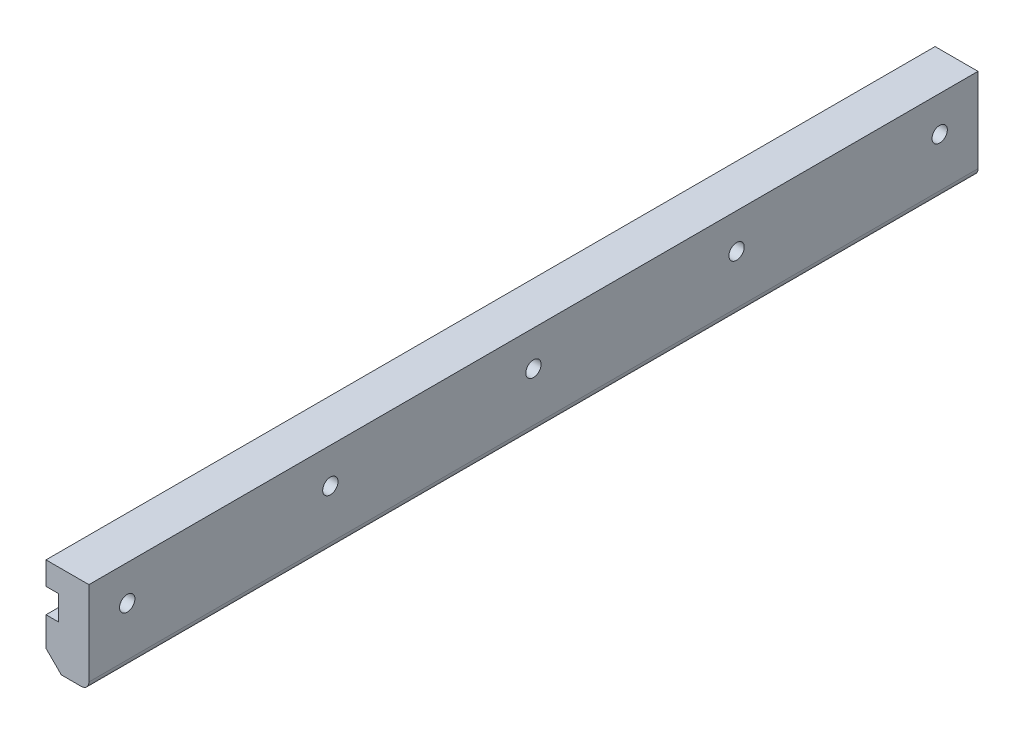
ISO-10303-21;
HEADER;
FILE_DESCRIPTION(('STEP AP214'),'2;1');
FILE_NAME('part.step','',(''),(''),'','','');
FILE_SCHEMA(('AUTOMOTIVE_DESIGN { 1 0 10303 214 1 1 1 1 }'));
ENDSEC;
DATA;
#1=APPLICATION_CONTEXT('core data for automotive mechanical design processes');
#2=APPLICATION_PROTOCOL_DEFINITION('international standard','automotive_design',2000,#1);
#3=PRODUCT_CONTEXT('',#1,'mechanical');
#4=PRODUCT('Part','Part','',(#3));
#5=PRODUCT_RELATED_PRODUCT_CATEGORY('part','',(#4));
#6=PRODUCT_DEFINITION_FORMATION('','',#4);
#7=PRODUCT_DEFINITION_CONTEXT('part definition',#1,'design');
#8=PRODUCT_DEFINITION('design','',#6,#7);
#9=PRODUCT_DEFINITION_SHAPE('','',#8);
#10=(LENGTH_UNIT() NAMED_UNIT(*) SI_UNIT(.MILLI.,.METRE.));
#11=(NAMED_UNIT(*) PLANE_ANGLE_UNIT() SI_UNIT($,.RADIAN.));
#12=(NAMED_UNIT(*) SI_UNIT($,.STERADIAN.) SOLID_ANGLE_UNIT());
#13=UNCERTAINTY_MEASURE_WITH_UNIT(LENGTH_MEASURE(1.E-05),#10,'distance_accuracy_value','');
#14=(GEOMETRIC_REPRESENTATION_CONTEXT(3) GLOBAL_UNCERTAINTY_ASSIGNED_CONTEXT((#13)) GLOBAL_UNIT_ASSIGNED_CONTEXT((#10,
#11,#12)) REPRESENTATION_CONTEXT('',''));
#15=CARTESIAN_POINT('',(0.,0.,0.));
#16=DIRECTION('',(0.,0.,1.));
#17=DIRECTION('',(1.,0.,0.));
#18=AXIS2_PLACEMENT_3D('',#15,#16,#17);
#19=CARTESIAN_POINT('',(-28.,60.,290.));
#20=DIRECTION('',(0.,-1.,0.));
#21=DIRECTION('',(0.,0.,-1.));
#22=AXIS2_PLACEMENT_3D('',#19,#20,#21);
#23=PLANE('',#22);
#24=DIRECTION('',(-1.,0.,0.));
#25=VECTOR('',#24,1.);
#26=CARTESIAN_POINT('',(-28.,60.,-290.));
#27=LINE('',#26,#25);
#28=CARTESIAN_POINT('',(0.,60.,-290.));
#29=VERTEX_POINT('',#28);
#30=CARTESIAN_POINT('',(-28.,60.,-290.));
#31=VERTEX_POINT('',#30);
#32=EDGE_CURVE('E158',#29,#31,#27,.T.);
#33=ORIENTED_EDGE('',*,*,#32,.T.);
#34=DIRECTION('',(0.,0.,-1.));
#35=VECTOR('',#34,1.);
#36=CARTESIAN_POINT('',(-28.,60.,290.));
#37=LINE('',#36,#35);
#38=CARTESIAN_POINT('',(-28.,60.,290.));
#39=VERTEX_POINT('',#38);
#40=EDGE_CURVE('E11',#39,#31,#37,.T.);
#41=ORIENTED_EDGE('',*,*,#40,.F.);
#42=DIRECTION('',(-1.,0.,0.));
#43=VECTOR('',#42,1.);
#44=CARTESIAN_POINT('',(-28.,60.,290.));
#45=LINE('',#44,#43);
#46=CARTESIAN_POINT('',(0.,60.,290.));
#47=VERTEX_POINT('',#46);
#48=EDGE_CURVE('E187',#47,#39,#45,.T.);
#49=ORIENTED_EDGE('',*,*,#48,.F.);
#50=DIRECTION('',(0.,0.,-1.));
#51=VECTOR('',#50,1.);
#52=CARTESIAN_POINT('',(0.,60.,290.));
#53=LINE('',#52,#51);
#54=EDGE_CURVE('E154',#47,#29,#53,.T.);
#55=ORIENTED_EDGE('',*,*,#54,.T.);
#56=EDGE_LOOP('',(#33,#41,#49,#55));
#57=FACE_BOUND('',#56,.T.);
#58=ADVANCED_FACE('F45',(#57),#23,.F.);
#59=CARTESIAN_POINT('',(-28.,45.,290.));
#60=DIRECTION('',(1.,0.,0.));
#61=DIRECTION('',(0.,0.,-1.));
#62=AXIS2_PLACEMENT_3D('',#59,#60,#61);
#63=PLANE('',#62);
#64=DIRECTION('',(0.,-1.,0.));
#65=VECTOR('',#64,1.);
#66=CARTESIAN_POINT('',(-28.,45.,-290.));
#67=LINE('',#66,#65);
#68=CARTESIAN_POINT('',(-28.,45.,-290.));
#69=VERTEX_POINT('',#68);
#70=EDGE_CURVE('E162',#31,#69,#67,.T.);
#71=ORIENTED_EDGE('',*,*,#70,.T.);
#72=DIRECTION('',(0.,0.,-1.));
#73=VECTOR('',#72,1.);
#74=CARTESIAN_POINT('',(-28.,45.,290.));
#75=LINE('',#74,#73);
#76=CARTESIAN_POINT('',(-28.,45.,290.));
#77=VERTEX_POINT('',#76);
#78=EDGE_CURVE('E54',#77,#69,#75,.T.);
#79=ORIENTED_EDGE('',*,*,#78,.F.);
#80=DIRECTION('',(0.,-1.,0.));
#81=VECTOR('',#80,1.);
#82=CARTESIAN_POINT('',(-28.,45.,290.));
#83=LINE('',#82,#81);
#84=EDGE_CURVE('E111',#39,#77,#83,.T.);
#85=ORIENTED_EDGE('',*,*,#84,.F.);
#86=ORIENTED_EDGE('',*,*,#40,.T.);
#87=EDGE_LOOP('',(#71,#79,#85,#86));
#88=FACE_BOUND('',#87,.T.);
#89=ADVANCED_FACE('F321',(#88),#63,.F.);
#90=CARTESIAN_POINT('',(-20.,45.,290.));
#91=DIRECTION('',(0.,1.,0.));
#92=DIRECTION('',(-1.,0.,0.));
#93=AXIS2_PLACEMENT_3D('',#90,#91,#92);
#94=PLANE('',#93);
#95=DIRECTION('',(1.,0.,0.));
#96=VECTOR('',#95,1.);
#97=CARTESIAN_POINT('',(-20.,45.,-290.));
#98=LINE('',#97,#96);
#99=CARTESIAN_POINT('',(-20.,45.,-290.));
#100=VERTEX_POINT('',#99);
#101=EDGE_CURVE('E166',#69,#100,#98,.T.);
#102=ORIENTED_EDGE('',*,*,#101,.T.);
#103=DIRECTION('',(0.,0.,-1.));
#104=VECTOR('',#103,1.);
#105=CARTESIAN_POINT('',(-20.,45.,290.));
#106=LINE('',#105,#104);
#107=CARTESIAN_POINT('',(-20.,45.,290.));
#108=VERTEX_POINT('',#107);
#109=EDGE_CURVE('E206',#108,#100,#106,.T.);
#110=ORIENTED_EDGE('',*,*,#109,.F.);
#111=DIRECTION('',(1.,0.,0.));
#112=VECTOR('',#111,1.);
#113=CARTESIAN_POINT('',(-20.,45.,290.));
#114=LINE('',#113,#112);
#115=EDGE_CURVE('E216',#77,#108,#114,.T.);
#116=ORIENTED_EDGE('',*,*,#115,.F.);
#117=ORIENTED_EDGE('',*,*,#78,.T.);
#118=EDGE_LOOP('',(#102,#110,#116,#117));
#119=FACE_BOUND('',#118,.T.);
#120=ADVANCED_FACE('F214',(#119),#94,.F.);
#121=CARTESIAN_POINT('',(-20.,29.,290.));
#122=DIRECTION('',(1.,0.,0.));
#123=DIRECTION('',(0.,0.,-1.));
#124=AXIS2_PLACEMENT_3D('',#121,#122,#123);
#125=PLANE('',#124);
#126=CARTESIAN_POINT('',(-20.,37.,265.));
#127=DIRECTION('',(1.,0.,0.));
#128=DIRECTION('',(0.,0.,-1.));
#129=AXIS2_PLACEMENT_3D('',#126,#127,#128);
#130=CIRCLE('',#129,4.99999999999999);
#131=CARTESIAN_POINT('',(-20.,37.,260.));
#132=VERTEX_POINT('',#131);
#133=EDGE_CURVE('E163',#132,#132,#130,.T.);
#134=ORIENTED_EDGE('',*,*,#133,.T.);
#135=EDGE_LOOP('',(#134));
#136=FACE_BOUND('',#135,.T.);
#137=CARTESIAN_POINT('',(-20.,37.,132.5));
#138=DIRECTION('',(1.,0.,0.));
#139=DIRECTION('',(0.,0.,-1.));
#140=AXIS2_PLACEMENT_3D('',#137,#138,#139);
#141=CIRCLE('',#140,4.99999999999999);
#142=CARTESIAN_POINT('',(-20.,37.,127.5));
#143=VERTEX_POINT('',#142);
#144=EDGE_CURVE('E252',#143,#143,#141,.T.);
#145=ORIENTED_EDGE('',*,*,#144,.T.);
#146=EDGE_LOOP('',(#145));
#147=FACE_BOUND('',#146,.T.);
#148=CARTESIAN_POINT('',(-20.,37.,0.));
#149=DIRECTION('',(1.,0.,0.));
#150=DIRECTION('',(0.,0.,-1.));
#151=AXIS2_PLACEMENT_3D('',#148,#149,#150);
#152=CIRCLE('',#151,4.99999999999999);
#153=CARTESIAN_POINT('',(-20.,37.,-5.00000000000005));
#154=VERTEX_POINT('',#153);
#155=EDGE_CURVE('E256',#154,#154,#152,.T.);
#156=ORIENTED_EDGE('',*,*,#155,.T.);
#157=EDGE_LOOP('',(#156));
#158=FACE_BOUND('',#157,.T.);
#159=CARTESIAN_POINT('',(-20.,37.,-132.5));
#160=DIRECTION('',(1.,0.,0.));
#161=DIRECTION('',(0.,0.,-1.));
#162=AXIS2_PLACEMENT_3D('',#159,#160,#161);
#163=CIRCLE('',#162,4.99999999999999);
#164=CARTESIAN_POINT('',(-20.,37.,-137.5));
#165=VERTEX_POINT('',#164);
#166=EDGE_CURVE('E260',#165,#165,#163,.T.);
#167=ORIENTED_EDGE('',*,*,#166,.T.);
#168=EDGE_LOOP('',(#167));
#169=FACE_BOUND('',#168,.T.);
#170=CARTESIAN_POINT('',(-20.,37.,-265.));
#171=DIRECTION('',(1.,0.,0.));
#172=DIRECTION('',(0.,0.,-1.));
#173=AXIS2_PLACEMENT_3D('',#170,#171,#172);
#174=CIRCLE('',#173,4.99999999999999);
#175=CARTESIAN_POINT('',(-20.,37.,-270.));
#176=VERTEX_POINT('',#175);
#177=EDGE_CURVE('E264',#176,#176,#174,.T.);
#178=ORIENTED_EDGE('',*,*,#177,.T.);
#179=EDGE_LOOP('',(#178));
#180=FACE_BOUND('',#179,.T.);
#181=DIRECTION('',(0.,-1.,0.));
#182=VECTOR('',#181,1.);
#183=CARTESIAN_POINT('',(-20.,29.,-290.));
#184=LINE('',#183,#182);
#185=CARTESIAN_POINT('',(-20.,29.,-290.));
#186=VERTEX_POINT('',#185);
#187=EDGE_CURVE('E169',#100,#186,#184,.T.);
#188=ORIENTED_EDGE('',*,*,#187,.T.);
#189=DIRECTION('',(0.,0.,-1.));
#190=VECTOR('',#189,1.);
#191=CARTESIAN_POINT('',(-20.,29.,290.));
#192=LINE('',#191,#190);
#193=CARTESIAN_POINT('',(-20.,29.,290.));
#194=VERTEX_POINT('',#193);
#195=EDGE_CURVE('E202',#194,#186,#192,.T.);
#196=ORIENTED_EDGE('',*,*,#195,.F.);
#197=DIRECTION('',(0.,-1.,0.));
#198=VECTOR('',#197,1.);
#199=CARTESIAN_POINT('',(-20.,29.,290.));
#200=LINE('',#199,#198);
#201=EDGE_CURVE('E235',#108,#194,#200,.T.);
#202=ORIENTED_EDGE('',*,*,#201,.F.);
#203=ORIENTED_EDGE('',*,*,#109,.T.);
#204=EDGE_LOOP('',(#188,#196,#202,#203));
#205=FACE_BOUND('',#204,.T.);
#206=ADVANCED_FACE('F225',(#136,#147,#158,#169,#180,#205),#125,.F.);
#207=CARTESIAN_POINT('',(-28.,29.,290.));
#208=DIRECTION('',(0.,-1.,0.));
#209=DIRECTION('',(0.,0.,-1.));
#210=AXIS2_PLACEMENT_3D('',#207,#208,#209);
#211=PLANE('',#210);
#212=DIRECTION('',(-1.,0.,0.));
#213=VECTOR('',#212,1.);
#214=CARTESIAN_POINT('',(-28.,29.,-290.));
#215=LINE('',#214,#213);
#216=CARTESIAN_POINT('',(-28.,29.,-290.));
#217=VERTEX_POINT('',#216);
#218=EDGE_CURVE('E172',#186,#217,#215,.T.);
#219=ORIENTED_EDGE('',*,*,#218,.T.);
#220=DIRECTION('',(0.,0.,-1.));
#221=VECTOR('',#220,1.);
#222=CARTESIAN_POINT('',(-28.,29.,290.));
#223=LINE('',#222,#221);
#224=CARTESIAN_POINT('',(-28.,29.,290.));
#225=VERTEX_POINT('',#224);
#226=EDGE_CURVE('E198',#225,#217,#223,.T.);
#227=ORIENTED_EDGE('',*,*,#226,.F.);
#228=DIRECTION('',(-1.,0.,0.));
#229=VECTOR('',#228,1.);
#230=CARTESIAN_POINT('',(-28.,29.,290.));
#231=LINE('',#230,#229);
#232=EDGE_CURVE('E231',#194,#225,#231,.T.);
#233=ORIENTED_EDGE('',*,*,#232,.F.);
#234=ORIENTED_EDGE('',*,*,#195,.T.);
#235=EDGE_LOOP('',(#219,#227,#233,#234));
#236=FACE_BOUND('',#235,.T.);
#237=ADVANCED_FACE('F229',(#236),#211,.F.);
#238=CARTESIAN_POINT('',(-28.,10.,290.));
#239=DIRECTION('',(1.,0.,0.));
#240=DIRECTION('',(0.,0.,-1.));
#241=AXIS2_PLACEMENT_3D('',#238,#239,#240);
#242=PLANE('',#241);
#243=DIRECTION('',(0.,-1.,0.));
#244=VECTOR('',#243,1.);
#245=CARTESIAN_POINT('',(-28.,10.,-290.));
#246=LINE('',#245,#244);
#247=CARTESIAN_POINT('',(-28.,10.,-290.));
#248=VERTEX_POINT('',#247);
#249=EDGE_CURVE('E175',#217,#248,#246,.T.);
#250=ORIENTED_EDGE('',*,*,#249,.T.);
#251=DIRECTION('',(0.,0.,-1.));
#252=VECTOR('',#251,1.);
#253=CARTESIAN_POINT('',(-28.,10.,290.));
#254=LINE('',#253,#252);
#255=CARTESIAN_POINT('',(-28.,10.,290.));
#256=VERTEX_POINT('',#255);
#257=EDGE_CURVE('E194',#256,#248,#254,.T.);
#258=ORIENTED_EDGE('',*,*,#257,.F.);
#259=DIRECTION('',(0.,-1.,0.));
#260=VECTOR('',#259,1.);
#261=CARTESIAN_POINT('',(-28.,10.,290.));
#262=LINE('',#261,#260);
#263=EDGE_CURVE('E234',#225,#256,#262,.T.);
#264=ORIENTED_EDGE('',*,*,#263,.F.);
#265=ORIENTED_EDGE('',*,*,#226,.T.);
#266=EDGE_LOOP('',(#250,#258,#264,#265));
#267=FACE_BOUND('',#266,.T.);
#268=ADVANCED_FACE('F318',(#267),#242,.F.);
#269=CARTESIAN_POINT('',(-18.,0.,290.));
#270=DIRECTION('',(0.707106781186546,0.707106781186549,0.));
#271=DIRECTION('',(-0.707106781186549,0.707106781186546,0.));
#272=AXIS2_PLACEMENT_3D('',#269,#270,#271);
#273=PLANE('',#272);
#274=DIRECTION('',(0.707106781186549,-0.707106781186546,0.));
#275=VECTOR('',#274,1.);
#276=CARTESIAN_POINT('',(-18.,0.,-290.));
#277=LINE('',#276,#275);
#278=CARTESIAN_POINT('',(-18.,0.,-290.));
#279=VERTEX_POINT('',#278);
#280=EDGE_CURVE('E178',#248,#279,#277,.T.);
#281=ORIENTED_EDGE('',*,*,#280,.T.);
#282=DIRECTION('',(0.,0.,-1.));
#283=VECTOR('',#282,1.);
#284=CARTESIAN_POINT('',(-18.,0.,290.));
#285=LINE('',#284,#283);
#286=CARTESIAN_POINT('',(-18.,0.,290.));
#287=VERTEX_POINT('',#286);
#288=EDGE_CURVE('E147',#287,#279,#285,.T.);
#289=ORIENTED_EDGE('',*,*,#288,.F.);
#290=DIRECTION('',(0.707106781186549,-0.707106781186546,0.));
#291=VECTOR('',#290,1.);
#292=CARTESIAN_POINT('',(-18.,0.,290.));
#293=LINE('',#292,#291);
#294=EDGE_CURVE('E136',#256,#287,#293,.T.);
#295=ORIENTED_EDGE('',*,*,#294,.F.);
#296=ORIENTED_EDGE('',*,*,#257,.T.);
#297=EDGE_LOOP('',(#281,#289,#295,#296));
#298=FACE_BOUND('',#297,.T.);
#299=ADVANCED_FACE('F333',(#298),#273,.F.);
#300=CARTESIAN_POINT('',(-5.00000000000003,0.,290.));
#301=DIRECTION('',(0.,1.,0.));
#302=DIRECTION('',(-1.,0.,0.));
#303=AXIS2_PLACEMENT_3D('',#300,#301,#302);
#304=PLANE('',#303);
#305=DIRECTION('',(1.,0.,0.));
#306=VECTOR('',#305,1.);
#307=CARTESIAN_POINT('',(-5.00000000000003,0.,-290.));
#308=LINE('',#307,#306);
#309=CARTESIAN_POINT('',(-5.00000000000003,0.,-290.));
#310=VERTEX_POINT('',#309);
#311=EDGE_CURVE('E145',#279,#310,#308,.T.);
#312=ORIENTED_EDGE('',*,*,#311,.T.);
#313=DIRECTION('',(0.,0.,-1.));
#314=VECTOR('',#313,1.);
#315=CARTESIAN_POINT('',(-5.00000000000003,0.,290.));
#316=LINE('',#315,#314);
#317=CARTESIAN_POINT('',(-5.00000000000003,0.,290.));
#318=VERTEX_POINT('',#317);
#319=EDGE_CURVE('E142',#318,#310,#316,.T.);
#320=ORIENTED_EDGE('',*,*,#319,.F.);
#321=DIRECTION('',(1.,0.,0.));
#322=VECTOR('',#321,1.);
#323=CARTESIAN_POINT('',(-5.00000000000003,0.,290.));
#324=LINE('',#323,#322);
#325=EDGE_CURVE('E130',#287,#318,#324,.T.);
#326=ORIENTED_EDGE('',*,*,#325,.F.);
#327=ORIENTED_EDGE('',*,*,#288,.T.);
#328=EDGE_LOOP('',(#312,#320,#326,#327));
#329=FACE_BOUND('',#328,.T.);
#330=ADVANCED_FACE('F143',(#329),#304,.F.);
#331=CARTESIAN_POINT('',(-5.,5.,290.));
#332=DIRECTION('',(0.,0.,-1.));
#333=DIRECTION('',(-1.,0.,0.));
#334=AXIS2_PLACEMENT_3D('',#331,#332,#333);
#335=CYLINDRICAL_SURFACE('',#334,5.);
#336=CARTESIAN_POINT('',(-5.,5.,-290.));
#337=DIRECTION('',(0.,0.,1.));
#338=DIRECTION('',(-1.,0.,0.));
#339=AXIS2_PLACEMENT_3D('',#336,#337,#338);
#340=CIRCLE('',#339,5.);
#341=CARTESIAN_POINT('',(0.,5.00000000000003,-290.));
#342=VERTEX_POINT('',#341);
#343=EDGE_CURVE('E97',#310,#342,#340,.T.);
#344=ORIENTED_EDGE('',*,*,#343,.T.);
#345=DIRECTION('',(0.,0.,-1.));
#346=VECTOR('',#345,1.);
#347=CARTESIAN_POINT('',(0.,5.00000000000003,290.));
#348=LINE('',#347,#346);
#349=CARTESIAN_POINT('',(0.,5.00000000000003,290.));
#350=VERTEX_POINT('',#349);
#351=EDGE_CURVE('E148',#350,#342,#348,.T.);
#352=ORIENTED_EDGE('',*,*,#351,.F.);
#353=CARTESIAN_POINT('',(-5.,5.,290.));
#354=DIRECTION('',(0.,0.,1.));
#355=DIRECTION('',(-1.,0.,0.));
#356=AXIS2_PLACEMENT_3D('',#353,#354,#355);
#357=CIRCLE('',#356,5.);
#358=EDGE_CURVE('E134',#318,#350,#357,.T.);
#359=ORIENTED_EDGE('',*,*,#358,.F.);
#360=ORIENTED_EDGE('',*,*,#319,.T.);
#361=EDGE_LOOP('',(#344,#352,#359,#360));
#362=FACE_BOUND('',#361,.T.);
#363=ADVANCED_FACE('F150',(#362),#335,.T.);
#364=CARTESIAN_POINT('',(0.,60.,290.));
#365=DIRECTION('',(-1.,0.,0.));
#366=DIRECTION('',(0.,-1.,0.));
#367=AXIS2_PLACEMENT_3D('',#364,#365,#366);
#368=PLANE('',#367);
#369=CARTESIAN_POINT('',(0.,37.,265.));
#370=DIRECTION('',(1.,0.,0.));
#371=DIRECTION('',(0.,1.,0.));
#372=AXIS2_PLACEMENT_3D('',#369,#370,#371);
#373=CIRCLE('',#372,4.99999999999999);
#374=CARTESIAN_POINT('',(0.,42.,265.));
#375=VERTEX_POINT('',#374);
#376=EDGE_CURVE('E268',#375,#375,#373,.T.);
#377=ORIENTED_EDGE('',*,*,#376,.F.);
#378=EDGE_LOOP('',(#377));
#379=FACE_BOUND('',#378,.T.);
#380=CARTESIAN_POINT('',(0.,37.,132.5));
#381=DIRECTION('',(1.,0.,0.));
#382=DIRECTION('',(0.,1.,0.));
#383=AXIS2_PLACEMENT_3D('',#380,#381,#382);
#384=CIRCLE('',#383,4.99999999999999);
#385=CARTESIAN_POINT('',(0.,42.,132.5));
#386=VERTEX_POINT('',#385);
#387=EDGE_CURVE('E281',#386,#386,#384,.T.);
#388=ORIENTED_EDGE('',*,*,#387,.F.);
#389=EDGE_LOOP('',(#388));
#390=FACE_BOUND('',#389,.T.);
#391=CARTESIAN_POINT('',(0.,37.,0.));
#392=DIRECTION('',(1.,0.,0.));
#393=DIRECTION('',(0.,1.,0.));
#394=AXIS2_PLACEMENT_3D('',#391,#392,#393);
#395=CIRCLE('',#394,4.99999999999999);
#396=CARTESIAN_POINT('',(0.,42.,0.));
#397=VERTEX_POINT('',#396);
#398=EDGE_CURVE('E277',#397,#397,#395,.T.);
#399=ORIENTED_EDGE('',*,*,#398,.F.);
#400=EDGE_LOOP('',(#399));
#401=FACE_BOUND('',#400,.T.);
#402=CARTESIAN_POINT('',(0.,37.,-132.5));
#403=DIRECTION('',(1.,0.,0.));
#404=DIRECTION('',(0.,1.,0.));
#405=AXIS2_PLACEMENT_3D('',#402,#403,#404);
#406=CIRCLE('',#405,4.99999999999999);
#407=CARTESIAN_POINT('',(0.,42.,-132.5));
#408=VERTEX_POINT('',#407);
#409=EDGE_CURVE('E273',#408,#408,#406,.T.);
#410=ORIENTED_EDGE('',*,*,#409,.F.);
#411=EDGE_LOOP('',(#410));
#412=FACE_BOUND('',#411,.T.);
#413=CARTESIAN_POINT('',(0.,37.,-265.));
#414=DIRECTION('',(1.,0.,0.));
#415=DIRECTION('',(0.,1.,0.));
#416=AXIS2_PLACEMENT_3D('',#413,#414,#415);
#417=CIRCLE('',#416,4.99999999999999);
#418=CARTESIAN_POINT('',(0.,42.,-265.));
#419=VERTEX_POINT('',#418);
#420=EDGE_CURVE('E269',#419,#419,#417,.T.);
#421=ORIENTED_EDGE('',*,*,#420,.F.);
#422=EDGE_LOOP('',(#421));
#423=FACE_BOUND('',#422,.T.);
#424=DIRECTION('',(0.,1.,0.));
#425=VECTOR('',#424,1.);
#426=CARTESIAN_POINT('',(0.,60.,-290.));
#427=LINE('',#426,#425);
#428=EDGE_CURVE('E103',#342,#29,#427,.T.);
#429=ORIENTED_EDGE('',*,*,#428,.T.);
#430=ORIENTED_EDGE('',*,*,#54,.F.);
#431=DIRECTION('',(0.,1.,0.));
#432=VECTOR('',#431,1.);
#433=CARTESIAN_POINT('',(0.,60.,290.));
#434=LINE('',#433,#432);
#435=EDGE_CURVE('E62',#350,#47,#434,.T.);
#436=ORIENTED_EDGE('',*,*,#435,.F.);
#437=ORIENTED_EDGE('',*,*,#351,.T.);
#438=EDGE_LOOP('',(#429,#430,#436,#437));
#439=FACE_BOUND('',#438,.T.);
#440=ADVANCED_FACE('F292',(#379,#390,#401,#412,#423,#439),#368,.F.);
#441=CARTESIAN_POINT('',(-5.,5.,290.));
#442=DIRECTION('',(0.,0.,-1.));
#443=DIRECTION('',(-1.,0.,0.));
#444=AXIS2_PLACEMENT_3D('',#441,#442,#443);
#445=PLANE('',#444);
#446=ORIENTED_EDGE('',*,*,#48,.T.);
#447=ORIENTED_EDGE('',*,*,#84,.T.);
#448=ORIENTED_EDGE('',*,*,#115,.T.);
#449=ORIENTED_EDGE('',*,*,#201,.T.);
#450=ORIENTED_EDGE('',*,*,#232,.T.);
#451=ORIENTED_EDGE('',*,*,#263,.T.);
#452=ORIENTED_EDGE('',*,*,#294,.T.);
#453=ORIENTED_EDGE('',*,*,#325,.T.);
#454=ORIENTED_EDGE('',*,*,#358,.T.);
#455=ORIENTED_EDGE('',*,*,#435,.T.);
#456=EDGE_LOOP('',(#446,#447,#448,#449,#450,#451,#452,#453,#454,#455));
#457=FACE_BOUND('',#456,.T.);
#458=ADVANCED_FACE('F132',(#457),#445,.F.);
#459=CARTESIAN_POINT('',(-5.,5.,-290.));
#460=DIRECTION('',(0.,0.,-1.));
#461=DIRECTION('',(-1.,0.,0.));
#462=AXIS2_PLACEMENT_3D('',#459,#460,#461);
#463=PLANE('',#462);
#464=ORIENTED_EDGE('',*,*,#32,.F.);
#465=ORIENTED_EDGE('',*,*,#428,.F.);
#466=ORIENTED_EDGE('',*,*,#343,.F.);
#467=ORIENTED_EDGE('',*,*,#311,.F.);
#468=ORIENTED_EDGE('',*,*,#280,.F.);
#469=ORIENTED_EDGE('',*,*,#249,.F.);
#470=ORIENTED_EDGE('',*,*,#218,.F.);
#471=ORIENTED_EDGE('',*,*,#187,.F.);
#472=ORIENTED_EDGE('',*,*,#101,.F.);
#473=ORIENTED_EDGE('',*,*,#70,.F.);
#474=EDGE_LOOP('',(#464,#465,#466,#467,#468,#469,#470,#471,#472,#473));
#475=FACE_BOUND('',#474,.T.);
#476=ADVANCED_FACE('F220',(#475),#463,.T.);
#477=CARTESIAN_POINT('',(-28.,37.,-265.));
#478=DIRECTION('',(1.,0.,0.));
#479=DIRECTION('',(0.,1.,0.));
#480=AXIS2_PLACEMENT_3D('',#477,#478,#479);
#481=CYLINDRICAL_SURFACE('',#480,4.99999999999999);
#482=ORIENTED_EDGE('',*,*,#420,.T.);
#483=EDGE_LOOP('',(#482));
#484=FACE_BOUND('',#483,.T.);
#485=ORIENTED_EDGE('',*,*,#177,.F.);
#486=EDGE_LOOP('',(#485));
#487=FACE_BOUND('',#486,.T.);
#488=ADVANCED_FACE('F304',(#484,#487),#481,.F.);
#489=CARTESIAN_POINT('',(-28.,37.,-132.5));
#490=DIRECTION('',(1.,0.,0.));
#491=DIRECTION('',(0.,1.,0.));
#492=AXIS2_PLACEMENT_3D('',#489,#490,#491);
#493=CYLINDRICAL_SURFACE('',#492,4.99999999999999);
#494=ORIENTED_EDGE('',*,*,#409,.T.);
#495=EDGE_LOOP('',(#494));
#496=FACE_BOUND('',#495,.T.);
#497=ORIENTED_EDGE('',*,*,#166,.F.);
#498=EDGE_LOOP('',(#497));
#499=FACE_BOUND('',#498,.T.);
#500=ADVANCED_FACE('F307',(#496,#499),#493,.F.);
#501=CARTESIAN_POINT('',(-28.,37.,0.));
#502=DIRECTION('',(1.,0.,0.));
#503=DIRECTION('',(0.,1.,0.));
#504=AXIS2_PLACEMENT_3D('',#501,#502,#503);
#505=CYLINDRICAL_SURFACE('',#504,4.99999999999999);
#506=ORIENTED_EDGE('',*,*,#398,.T.);
#507=EDGE_LOOP('',(#506));
#508=FACE_BOUND('',#507,.T.);
#509=ORIENTED_EDGE('',*,*,#155,.F.);
#510=EDGE_LOOP('',(#509));
#511=FACE_BOUND('',#510,.T.);
#512=ADVANCED_FACE('F352',(#508,#511),#505,.F.);
#513=CARTESIAN_POINT('',(-28.,37.,132.5));
#514=DIRECTION('',(1.,0.,0.));
#515=DIRECTION('',(0.,1.,0.));
#516=AXIS2_PLACEMENT_3D('',#513,#514,#515);
#517=CYLINDRICAL_SURFACE('',#516,4.99999999999999);
#518=ORIENTED_EDGE('',*,*,#387,.T.);
#519=EDGE_LOOP('',(#518));
#520=FACE_BOUND('',#519,.T.);
#521=ORIENTED_EDGE('',*,*,#144,.F.);
#522=EDGE_LOOP('',(#521));
#523=FACE_BOUND('',#522,.T.);
#524=ADVANCED_FACE('F356',(#520,#523),#517,.F.);
#525=CARTESIAN_POINT('',(-28.,37.,265.));
#526=DIRECTION('',(1.,0.,0.));
#527=DIRECTION('',(0.,1.,0.));
#528=AXIS2_PLACEMENT_3D('',#525,#526,#527);
#529=CYLINDRICAL_SURFACE('',#528,4.99999999999999);
#530=ORIENTED_EDGE('',*,*,#376,.T.);
#531=EDGE_LOOP('',(#530));
#532=FACE_BOUND('',#531,.T.);
#533=ORIENTED_EDGE('',*,*,#133,.F.);
#534=EDGE_LOOP('',(#533));
#535=FACE_BOUND('',#534,.T.);
#536=ADVANCED_FACE('F289',(#532,#535),#529,.F.);
#537=CLOSED_SHELL('',(#58,#89,#120,#206,#237,#268,#299,#330,#363,#440,#458,#476,#488,#500,#512,
#524,#536));
#538=MANIFOLD_SOLID_BREP('B2',#537);
#539=ADVANCED_BREP_SHAPE_REPRESENTATION('',(#18,#538),#14);
#540=SHAPE_DEFINITION_REPRESENTATION(#9,#539);
ENDSEC;
END-ISO-10303-21;
